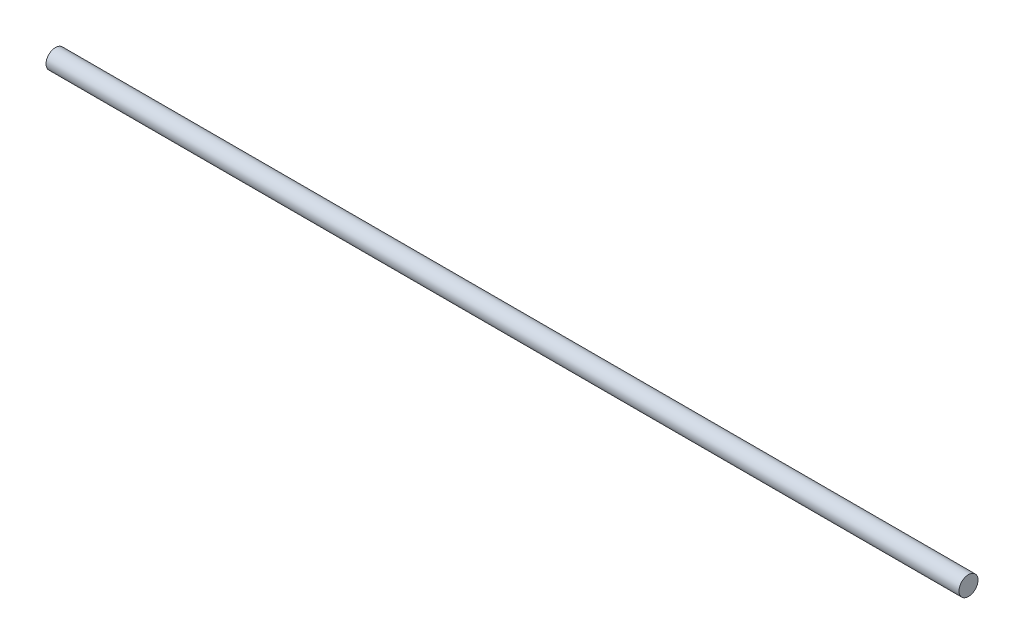
ISO-10303-21;
HEADER;
FILE_DESCRIPTION(('STEP AP214'),'2;1');
FILE_NAME('part.step','',(''),(''),'','','');
FILE_SCHEMA(('AUTOMOTIVE_DESIGN { 1 0 10303 214 1 1 1 1 }'));
ENDSEC;
DATA;
#1=APPLICATION_CONTEXT('core data for automotive mechanical design processes');
#2=APPLICATION_PROTOCOL_DEFINITION('international standard','automotive_design',2000,#1);
#3=PRODUCT_CONTEXT('',#1,'mechanical');
#4=PRODUCT('Part','Part','',(#3));
#5=PRODUCT_RELATED_PRODUCT_CATEGORY('part','',(#4));
#6=PRODUCT_DEFINITION_FORMATION('','',#4);
#7=PRODUCT_DEFINITION_CONTEXT('part definition',#1,'design');
#8=PRODUCT_DEFINITION('design','',#6,#7);
#9=PRODUCT_DEFINITION_SHAPE('','',#8);
#10=(LENGTH_UNIT() NAMED_UNIT(*) SI_UNIT(.MILLI.,.METRE.));
#11=(NAMED_UNIT(*) PLANE_ANGLE_UNIT() SI_UNIT($,.RADIAN.));
#12=(NAMED_UNIT(*) SI_UNIT($,.STERADIAN.) SOLID_ANGLE_UNIT());
#13=UNCERTAINTY_MEASURE_WITH_UNIT(LENGTH_MEASURE(1.E-05),#10,'distance_accuracy_value','');
#14=(GEOMETRIC_REPRESENTATION_CONTEXT(3) GLOBAL_UNCERTAINTY_ASSIGNED_CONTEXT((#13)) GLOBAL_UNIT_ASSIGNED_CONTEXT((#10,
#11,#12)) REPRESENTATION_CONTEXT('',''));
#15=CARTESIAN_POINT('',(0.,0.,0.));
#16=DIRECTION('',(0.,0.,1.));
#17=DIRECTION('',(1.,0.,0.));
#18=AXIS2_PLACEMENT_3D('',#15,#16,#17);
#19=CARTESIAN_POINT('',(304.8,0.,0.));
#20=DIRECTION('',(-1.,0.,0.));
#21=DIRECTION('',(0.,0.,1.));
#22=AXIS2_PLACEMENT_3D('',#19,#20,#21);
#23=CYLINDRICAL_SURFACE('',#22,6.35);
#24=CARTESIAN_POINT('',(304.8,0.,0.));
#25=DIRECTION('',(1.,0.,0.));
#26=DIRECTION('',(0.,0.,-1.));
#27=AXIS2_PLACEMENT_3D('',#24,#25,#26);
#28=CIRCLE('',#27,6.35);
#29=CARTESIAN_POINT('',(304.8,0.,6.35));
#30=VERTEX_POINT('',#29);
#31=EDGE_CURVE('E10',#30,#30,#28,.T.);
#32=CARTESIAN_POINT('',(-304.8,0.,0.));
#33=DIRECTION('',(1.,0.,0.));
#34=DIRECTION('',(0.,0.,-1.));
#35=AXIS2_PLACEMENT_3D('',#32,#33,#34);
#36=CIRCLE('',#35,6.35);
#37=CARTESIAN_POINT('',(-304.8,0.,6.35));
#38=VERTEX_POINT('',#37);
#39=EDGE_CURVE('E33',#38,#38,#36,.T.);
#40=CARTESIAN_POINT('',(304.8,0.,6.35));
#41=CARTESIAN_POINT('',(298.45,0.,6.35));
#42=CARTESIAN_POINT('',(292.1,0.,6.35));
#43=CARTESIAN_POINT('',(279.4,0.,6.35));
#44=CARTESIAN_POINT('',(273.05,0.,6.35));
#45=CARTESIAN_POINT('',(260.35,0.,6.35));
#46=CARTESIAN_POINT('',(254.,0.,6.35));
#47=CARTESIAN_POINT('',(241.3,0.,6.35));
#48=CARTESIAN_POINT('',(234.95,0.,6.35));
#49=CARTESIAN_POINT('',(222.25,0.,6.35));
#50=CARTESIAN_POINT('',(215.9,0.,6.35));
#51=CARTESIAN_POINT('',(203.2,0.,6.35));
#52=CARTESIAN_POINT('',(196.85,0.,6.35));
#53=CARTESIAN_POINT('',(184.15,0.,6.35));
#54=CARTESIAN_POINT('',(177.8,0.,6.35));
#55=CARTESIAN_POINT('',(165.1,0.,6.35));
#56=CARTESIAN_POINT('',(158.75,0.,6.35));
#57=CARTESIAN_POINT('',(146.05,0.,6.35));
#58=CARTESIAN_POINT('',(139.7,0.,6.35));
#59=CARTESIAN_POINT('',(127.,0.,6.35));
#60=CARTESIAN_POINT('',(120.65,0.,6.35));
#61=CARTESIAN_POINT('',(107.95,0.,6.35));
#62=CARTESIAN_POINT('',(101.6,0.,6.35));
#63=CARTESIAN_POINT('',(88.9,0.,6.35));
#64=CARTESIAN_POINT('',(82.55,0.,6.35));
#65=CARTESIAN_POINT('',(69.85,0.,6.35));
#66=CARTESIAN_POINT('',(63.5,0.,6.35));
#67=CARTESIAN_POINT('',(50.8,0.,6.35));
#68=CARTESIAN_POINT('',(44.45,0.,6.35));
#69=CARTESIAN_POINT('',(31.75,0.,6.35));
#70=CARTESIAN_POINT('',(25.4,0.,6.35));
#71=CARTESIAN_POINT('',(12.7,0.,6.35));
#72=CARTESIAN_POINT('',(6.34999999999995,0.,6.35));
#73=CARTESIAN_POINT('',(-6.35000000000006,0.,6.35));
#74=CARTESIAN_POINT('',(-12.7000000000001,0.,6.35));
#75=CARTESIAN_POINT('',(-25.4000000000001,0.,6.35));
#76=CARTESIAN_POINT('',(-31.7500000000001,0.,6.35));
#77=CARTESIAN_POINT('',(-44.4500000000001,0.,6.35));
#78=CARTESIAN_POINT('',(-50.8000000000001,0.,6.35));
#79=CARTESIAN_POINT('',(-63.5000000000001,0.,6.35));
#80=CARTESIAN_POINT('',(-69.8500000000001,0.,6.35));
#81=CARTESIAN_POINT('',(-82.5500000000001,0.,6.35));
#82=CARTESIAN_POINT('',(-88.9000000000001,0.,6.35));
#83=CARTESIAN_POINT('',(-101.6,0.,6.35));
#84=CARTESIAN_POINT('',(-107.95,0.,6.35));
#85=CARTESIAN_POINT('',(-120.65,0.,6.35));
#86=CARTESIAN_POINT('',(-127.,0.,6.35));
#87=CARTESIAN_POINT('',(-139.7,0.,6.35));
#88=CARTESIAN_POINT('',(-146.05,0.,6.35));
#89=CARTESIAN_POINT('',(-158.75,0.,6.35));
#90=CARTESIAN_POINT('',(-165.1,0.,6.35));
#91=CARTESIAN_POINT('',(-177.8,0.,6.35));
#92=CARTESIAN_POINT('',(-184.15,0.,6.35));
#93=CARTESIAN_POINT('',(-196.85,0.,6.35));
#94=CARTESIAN_POINT('',(-203.2,0.,6.35));
#95=CARTESIAN_POINT('',(-215.9,0.,6.35));
#96=CARTESIAN_POINT('',(-222.25,0.,6.35));
#97=CARTESIAN_POINT('',(-234.95,0.,6.35));
#98=CARTESIAN_POINT('',(-241.3,0.,6.35));
#99=CARTESIAN_POINT('',(-254.,0.,6.35));
#100=CARTESIAN_POINT('',(-260.35,0.,6.35));
#101=CARTESIAN_POINT('',(-273.05,0.,6.35));
#102=CARTESIAN_POINT('',(-279.4,0.,6.35));
#103=CARTESIAN_POINT('',(-292.1,0.,6.35));
#104=CARTESIAN_POINT('',(-298.45,0.,6.35));
#105=CARTESIAN_POINT('',(-304.8,0.,6.35));
#106=B_SPLINE_CURVE_WITH_KNOTS('',3,(#40,#41,#42,#43,#44,#45,#46,#47,#48,#49,#50,#51,#52,#53,
#54,#55,#56,#57,#58,#59,#60,#61,#62,#63,#64,#65,#66,#67,#68,#69,#70,#71,#72,#73,#74,#75,#76,#77,
#78,#79,#80,#81,#82,#83,#84,#85,#86,#87,#88,#89,#90,#91,#92,#93,#94,#95,#96,#97,#98,#99,#100,
#101,#102,#103,#104,#105),.UNSPECIFIED.,.F.,.F.,(4,2,2,2,2,2,2,2,2,2,2,2,2,2,2,2,2,2,2,2,2,2,2,
2,2,2,2,2,2,2,2,2,4),(0.,19.05,38.1,57.15,76.2,95.25,114.3,133.35,152.4,171.45,190.5,209.55,
228.6,247.65,266.7,285.75,304.8,323.85,342.9,361.95,381.,400.05,419.1,438.15,457.2,476.25,495.3,
514.35,533.4,552.45,571.5,590.55,609.6),.UNSPECIFIED.);
#107=EDGE_CURVE('BSEAM30',#30,#38,#106,.T.);
#108=ORIENTED_EDGE('',*,*,#31,.F.);
#109=ORIENTED_EDGE('',*,*,#39,.T.);
#110=ORIENTED_EDGE('',*,*,#107,.T.);
#111=ORIENTED_EDGE('',*,*,#107,.F.);
#112=EDGE_LOOP('',(#108,#110,#109,#111));
#113=FACE_BOUND('',#112,.T.);
#114=ADVANCED_FACE('F30',(#113),#23,.T.);
#115=CARTESIAN_POINT('',(304.8,0.,0.));
#116=DIRECTION('',(1.,0.,0.));
#117=DIRECTION('',(0.,0.,-1.));
#118=AXIS2_PLACEMENT_3D('',#115,#116,#117);
#119=PLANE('',#118);
#120=ORIENTED_EDGE('',*,*,#31,.T.);
#121=EDGE_LOOP('',(#120));
#122=FACE_BOUND('',#121,.T.);
#123=ADVANCED_FACE('F45',(#122),#119,.T.);
#124=CARTESIAN_POINT('',(-304.8,0.,0.));
#125=DIRECTION('',(1.,0.,0.));
#126=DIRECTION('',(0.,0.,-1.));
#127=AXIS2_PLACEMENT_3D('',#124,#125,#126);
#128=PLANE('',#127);
#129=ORIENTED_EDGE('',*,*,#39,.F.);
#130=EDGE_LOOP('',(#129));
#131=FACE_BOUND('',#130,.T.);
#132=ADVANCED_FACE('F43',(#131),#128,.F.);
#133=CLOSED_SHELL('',(#114,#123,#132));
#134=MANIFOLD_SOLID_BREP('B2',#133);
#135=ADVANCED_BREP_SHAPE_REPRESENTATION('',(#18,#134),#14);
#136=SHAPE_DEFINITION_REPRESENTATION(#9,#135);
ENDSEC;
END-ISO-10303-21;
